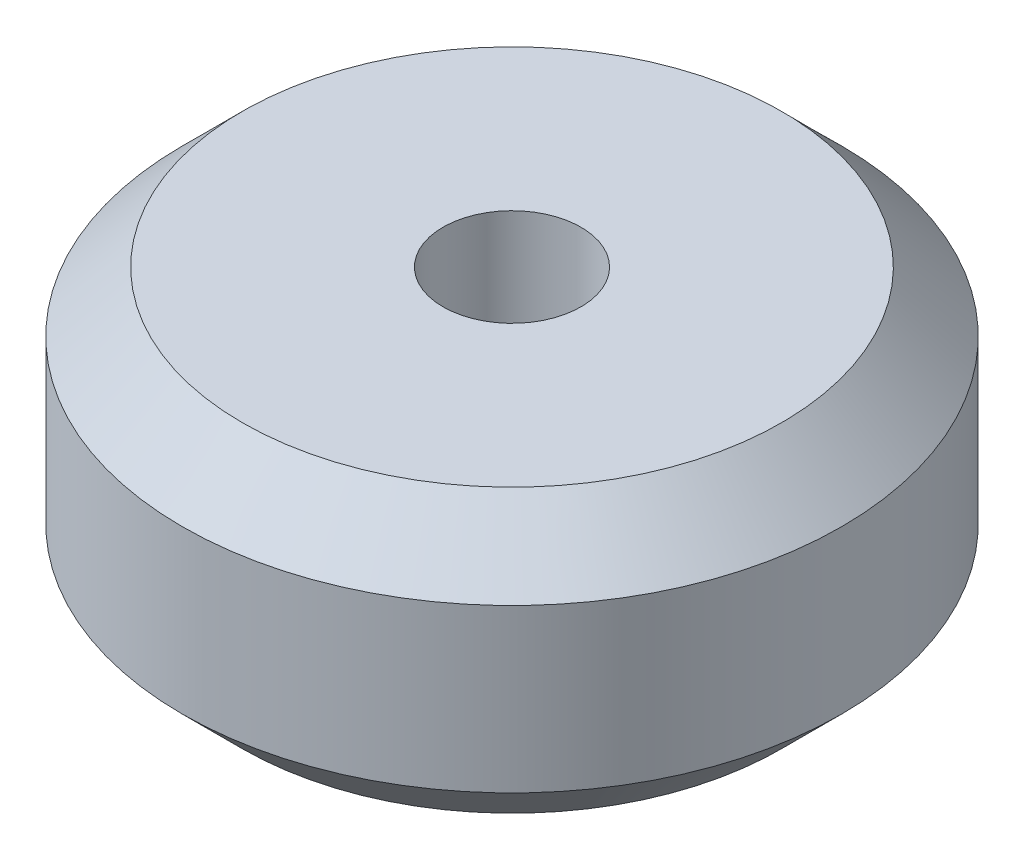
ISO-10303-21;
HEADER;
FILE_DESCRIPTION(('STEP AP214'),'2;1');
FILE_NAME('part.step','',(''),(''),'','','');
FILE_SCHEMA(('AUTOMOTIVE_DESIGN { 1 0 10303 214 1 1 1 1 }'));
ENDSEC;
DATA;
#1=APPLICATION_CONTEXT('core data for automotive mechanical design processes');
#2=APPLICATION_PROTOCOL_DEFINITION('international standard','automotive_design',2000,#1);
#3=PRODUCT_CONTEXT('',#1,'mechanical');
#4=PRODUCT('Part','Part','',(#3));
#5=PRODUCT_RELATED_PRODUCT_CATEGORY('part','',(#4));
#6=PRODUCT_DEFINITION_FORMATION('','',#4);
#7=PRODUCT_DEFINITION_CONTEXT('part definition',#1,'design');
#8=PRODUCT_DEFINITION('design','',#6,#7);
#9=PRODUCT_DEFINITION_SHAPE('','',#8);
#10=(LENGTH_UNIT() NAMED_UNIT(*) SI_UNIT(.MILLI.,.METRE.));
#11=(NAMED_UNIT(*) PLANE_ANGLE_UNIT() SI_UNIT($,.RADIAN.));
#12=(NAMED_UNIT(*) SI_UNIT($,.STERADIAN.) SOLID_ANGLE_UNIT());
#13=UNCERTAINTY_MEASURE_WITH_UNIT(LENGTH_MEASURE(1.E-05),#10,'distance_accuracy_value','');
#14=(GEOMETRIC_REPRESENTATION_CONTEXT(3) GLOBAL_UNCERTAINTY_ASSIGNED_CONTEXT((#13)) GLOBAL_UNIT_ASSIGNED_CONTEXT((#10,
#11,#12)) REPRESENTATION_CONTEXT('',''));
#15=CARTESIAN_POINT('',(0.,0.,0.));
#16=DIRECTION('',(0.,0.,1.));
#17=DIRECTION('',(1.,0.,0.));
#18=AXIS2_PLACEMENT_3D('',#15,#16,#17);
#19=CARTESIAN_POINT('',(0.,5.115,0.));
#20=DIRECTION('',(0.,1.,0.));
#21=DIRECTION('',(0.,0.,1.));
#22=AXIS2_PLACEMENT_3D('',#19,#20,#21);
#23=PLANE('',#22);
#24=CARTESIAN_POINT('',(0.,5.115,0.));
#25=DIRECTION('',(0.,1.,0.));
#26=DIRECTION('',(0.,0.,1.));
#27=AXIS2_PLACEMENT_3D('',#24,#25,#26);
#28=CIRCLE('',#27,9.77);
#29=CARTESIAN_POINT('',(0.,5.115,9.77));
#30=VERTEX_POINT('',#29);
#31=EDGE_CURVE('E10',#30,#30,#28,.T.);
#32=ORIENTED_EDGE('',*,*,#31,.T.);
#33=EDGE_LOOP('',(#32));
#34=FACE_BOUND('',#33,.T.);
#35=CARTESIAN_POINT('',(0.,5.115,0.));
#36=DIRECTION('',(0.,1.,0.));
#37=DIRECTION('',(0.,0.,1.));
#38=AXIS2_PLACEMENT_3D('',#35,#36,#37);
#39=CIRCLE('',#38,2.5);
#40=CARTESIAN_POINT('',(0.,5.115,2.5));
#41=VERTEX_POINT('',#40);
#42=EDGE_CURVE('E64',#41,#41,#39,.T.);
#43=ORIENTED_EDGE('',*,*,#42,.F.);
#44=EDGE_LOOP('',(#43));
#45=FACE_BOUND('',#44,.T.);
#46=ADVANCED_FACE('F39',(#34,#45),#23,.T.);
#47=CARTESIAN_POINT('',(0.,-5.115,0.));
#48=DIRECTION('',(0.,1.,0.));
#49=DIRECTION('',(0.,0.,1.));
#50=AXIS2_PLACEMENT_3D('',#47,#48,#49);
#51=PLANE('',#50);
#52=CARTESIAN_POINT('',(0.,-5.115,0.));
#53=DIRECTION('',(0.,1.,0.));
#54=DIRECTION('',(0.,0.,1.));
#55=AXIS2_PLACEMENT_3D('',#52,#53,#54);
#56=CIRCLE('',#55,9.77);
#57=CARTESIAN_POINT('',(0.,-5.115,9.77));
#58=VERTEX_POINT('',#57);
#59=EDGE_CURVE('E48',#58,#58,#56,.F.);
#60=ORIENTED_EDGE('',*,*,#59,.T.);
#61=EDGE_LOOP('',(#60));
#62=FACE_BOUND('',#61,.T.);
#63=CARTESIAN_POINT('',(0.,-5.115,0.));
#64=DIRECTION('',(0.,1.,0.));
#65=DIRECTION('',(0.,0.,1.));
#66=AXIS2_PLACEMENT_3D('',#63,#64,#65);
#67=CIRCLE('',#66,2.5);
#68=CARTESIAN_POINT('',(0.,-5.115,2.5));
#69=VERTEX_POINT('',#68);
#70=EDGE_CURVE('E65',#69,#69,#67,.T.);
#71=ORIENTED_EDGE('',*,*,#70,.T.);
#72=EDGE_LOOP('',(#71));
#73=FACE_BOUND('',#72,.T.);
#74=ADVANCED_FACE('F77',(#62,#73),#51,.F.);
#75=CARTESIAN_POINT('',(0.,5.115,0.));
#76=DIRECTION('',(0.,-1.,0.));
#77=DIRECTION('',(0.,0.,-1.));
#78=AXIS2_PLACEMENT_3D('',#75,#76,#77);
#79=CYLINDRICAL_SURFACE('',#78,11.945);
#80=CARTESIAN_POINT('',(0.,-2.94000000000001,0.));
#81=DIRECTION('',(0.,1.,0.));
#82=DIRECTION('',(0.,0.,1.));
#83=AXIS2_PLACEMENT_3D('',#80,#81,#82);
#84=CIRCLE('',#83,11.945);
#85=CARTESIAN_POINT('',(0.,-2.94000000000001,11.945));
#86=VERTEX_POINT('',#85);
#87=EDGE_CURVE('E53',#86,#86,#84,.T.);
#88=ORIENTED_EDGE('',*,*,#87,.T.);
#89=EDGE_LOOP('',(#88));
#90=FACE_BOUND('',#89,.T.);
#91=CARTESIAN_POINT('',(0.,2.94,0.));
#92=DIRECTION('',(0.,1.,0.));
#93=DIRECTION('',(0.,0.,1.));
#94=AXIS2_PLACEMENT_3D('',#91,#92,#93);
#95=CIRCLE('',#94,11.945);
#96=CARTESIAN_POINT('',(0.,2.94,11.945));
#97=VERTEX_POINT('',#96);
#98=EDGE_CURVE('E58',#97,#97,#95,.F.);
#99=ORIENTED_EDGE('',*,*,#98,.T.);
#100=EDGE_LOOP('',(#99));
#101=FACE_BOUND('',#100,.T.);
#102=ADVANCED_FACE('F82',(#90,#101),#79,.T.);
#103=CARTESIAN_POINT('',(0.,5.115,0.));
#104=DIRECTION('',(0.,-1.,0.));
#105=DIRECTION('',(0.,0.,-1.));
#106=AXIS2_PLACEMENT_3D('',#103,#104,#105);
#107=CYLINDRICAL_SURFACE('',#106,2.5);
#108=ORIENTED_EDGE('',*,*,#42,.T.);
#109=EDGE_LOOP('',(#108));
#110=FACE_BOUND('',#109,.T.);
#111=ORIENTED_EDGE('',*,*,#70,.F.);
#112=EDGE_LOOP('',(#111));
#113=FACE_BOUND('',#112,.T.);
#114=ADVANCED_FACE('F73',(#110,#113),#107,.F.);
#115=CARTESIAN_POINT('',(0.,-2.94000000000001,0.));
#116=DIRECTION('',(0.,1.,0.));
#117=DIRECTION('',(0.,0.,1.));
#118=AXIS2_PLACEMENT_3D('',#115,#116,#117);
#119=CONICAL_SURFACE('',#118,11.945,0.785398163397451);
#120=ORIENTED_EDGE('',*,*,#59,.F.);
#121=EDGE_LOOP('',(#120));
#122=FACE_BOUND('',#121,.T.);
#123=ORIENTED_EDGE('',*,*,#87,.F.);
#124=EDGE_LOOP('',(#123));
#125=FACE_BOUND('',#124,.T.);
#126=ADVANCED_FACE('F89',(#122,#125),#119,.T.);
#127=CARTESIAN_POINT('',(0.,5.115,0.));
#128=DIRECTION('',(0.,-1.,0.));
#129=DIRECTION('',(0.,0.,-1.));
#130=AXIS2_PLACEMENT_3D('',#127,#128,#129);
#131=CONICAL_SURFACE('',#130,9.77,0.785398163397448);
#132=ORIENTED_EDGE('',*,*,#98,.F.);
#133=EDGE_LOOP('',(#132));
#134=FACE_BOUND('',#133,.T.);
#135=ORIENTED_EDGE('',*,*,#31,.F.);
#136=EDGE_LOOP('',(#135));
#137=FACE_BOUND('',#136,.T.);
#138=ADVANCED_FACE('F42',(#134,#137),#131,.T.);
#139=CLOSED_SHELL('',(#46,#74,#102,#114,#126,#138));
#140=MANIFOLD_SOLID_BREP('B2',#139);
#141=ADVANCED_BREP_SHAPE_REPRESENTATION('',(#18,#140),#14);
#142=SHAPE_DEFINITION_REPRESENTATION(#9,#141);
ENDSEC;
END-ISO-10303-21;
